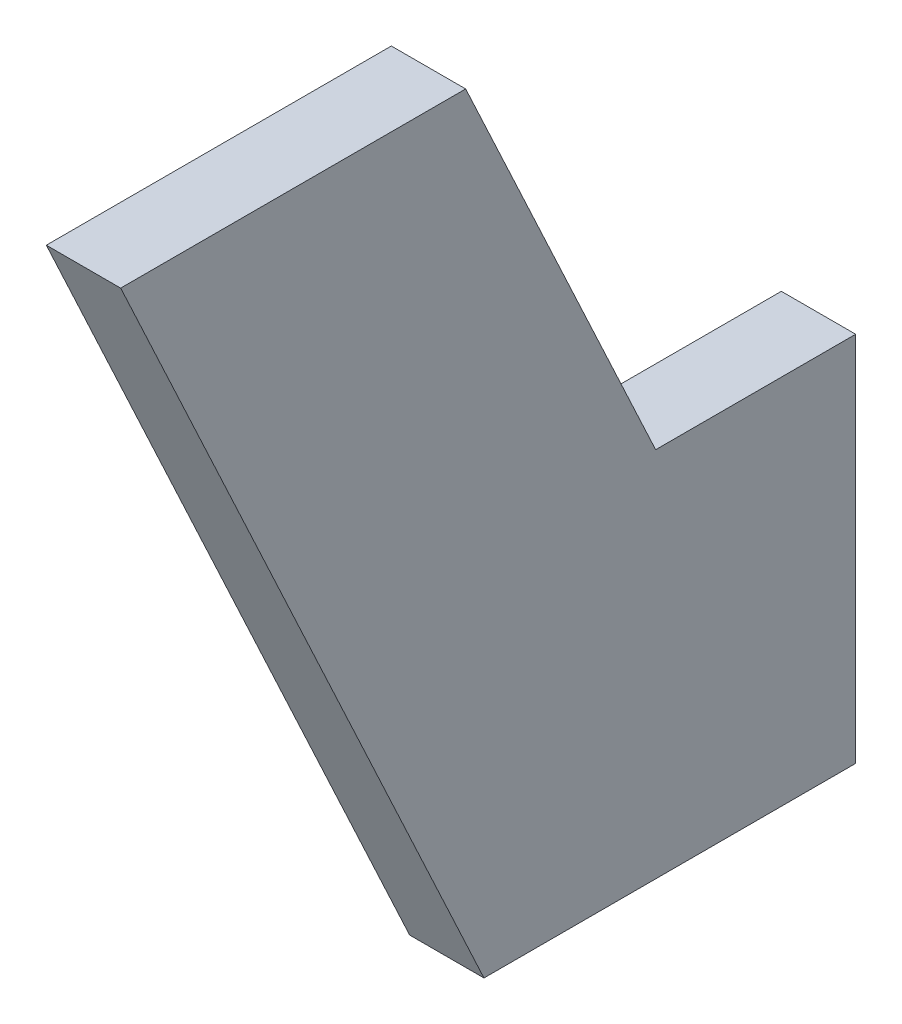
ISO-10303-21;
HEADER;
FILE_DESCRIPTION(('STEP AP214'),'2;1');
FILE_NAME('part.step','',(''),(''),'','','');
FILE_SCHEMA(('AUTOMOTIVE_DESIGN { 1 0 10303 214 1 1 1 1 }'));
ENDSEC;
DATA;
#1=APPLICATION_CONTEXT('core data for automotive mechanical design processes');
#2=APPLICATION_PROTOCOL_DEFINITION('international standard','automotive_design',2000,#1);
#3=PRODUCT_CONTEXT('',#1,'mechanical');
#4=PRODUCT('Part','Part','',(#3));
#5=PRODUCT_RELATED_PRODUCT_CATEGORY('part','',(#4));
#6=PRODUCT_DEFINITION_FORMATION('','',#4);
#7=PRODUCT_DEFINITION_CONTEXT('part definition',#1,'design');
#8=PRODUCT_DEFINITION('design','',#6,#7);
#9=PRODUCT_DEFINITION_SHAPE('','',#8);
#10=(LENGTH_UNIT() NAMED_UNIT(*) SI_UNIT(.MILLI.,.METRE.));
#11=(NAMED_UNIT(*) PLANE_ANGLE_UNIT() SI_UNIT($,.RADIAN.));
#12=(NAMED_UNIT(*) SI_UNIT($,.STERADIAN.) SOLID_ANGLE_UNIT());
#13=UNCERTAINTY_MEASURE_WITH_UNIT(LENGTH_MEASURE(1.E-05),#10,'distance_accuracy_value','');
#14=(GEOMETRIC_REPRESENTATION_CONTEXT(3) GLOBAL_UNCERTAINTY_ASSIGNED_CONTEXT((#13)) GLOBAL_UNIT_ASSIGNED_CONTEXT((#10,
#11,#12)) REPRESENTATION_CONTEXT('',''));
#15=CARTESIAN_POINT('',(0.,0.,0.));
#16=DIRECTION('',(0.,0.,1.));
#17=DIRECTION('',(1.,0.,0.));
#18=AXIS2_PLACEMENT_3D('',#15,#16,#17);
#19=CARTESIAN_POINT('',(0.,0.,0.));
#20=DIRECTION('',(0.,0.,1.));
#21=DIRECTION('',(1.,0.,0.));
#22=AXIS2_PLACEMENT_3D('',#19,#20,#21);
#23=PLANE('',#22);
#24=DIRECTION('',(0.,1.,0.));
#25=VECTOR('',#24,1.);
#26=CARTESIAN_POINT('',(7.99999999999999,40.,0.));
#27=LINE('',#26,#25);
#28=CARTESIAN_POINT('',(8.,-40.,0.));
#29=VERTEX_POINT('',#28);
#30=CARTESIAN_POINT('',(7.99999999999999,40.,0.));
#31=VERTEX_POINT('',#30);
#32=EDGE_CURVE('E136',#29,#31,#27,.T.);
#33=ORIENTED_EDGE('',*,*,#32,.F.);
#34=DIRECTION('',(1.,0.,0.));
#35=VECTOR('',#34,1.);
#36=CARTESIAN_POINT('',(-8.,-40.,0.));
#37=LINE('',#36,#35);
#38=CARTESIAN_POINT('',(-8.,-40.,0.));
#39=VERTEX_POINT('',#38);
#40=EDGE_CURVE('E141',#39,#29,#37,.T.);
#41=ORIENTED_EDGE('',*,*,#40,.F.);
#42=DIRECTION('',(0.,-1.,0.));
#43=VECTOR('',#42,1.);
#44=CARTESIAN_POINT('',(-8.00000000000001,40.,0.));
#45=LINE('',#44,#43);
#46=CARTESIAN_POINT('',(-8.00000000000001,40.,0.));
#47=VERTEX_POINT('',#46);
#48=EDGE_CURVE('E146',#47,#39,#45,.T.);
#49=ORIENTED_EDGE('',*,*,#48,.F.);
#50=DIRECTION('',(-1.,0.,0.));
#51=VECTOR('',#50,1.);
#52=CARTESIAN_POINT('',(-8.00000000000001,40.,0.));
#53=LINE('',#52,#51);
#54=EDGE_CURVE('E144',#31,#47,#53,.T.);
#55=ORIENTED_EDGE('',*,*,#54,.F.);
#56=EDGE_LOOP('',(#33,#41,#49,#55));
#57=FACE_BOUND('',#56,.T.);
#58=CARTESIAN_POINT('',(0.,32.0000000000001,0.));
#59=DIRECTION('',(0.,0.,1.));
#60=DIRECTION('',(1.,0.,0.));
#61=AXIS2_PLACEMENT_3D('',#58,#59,#60);
#62=CIRCLE('',#61,2.25);
#63=CARTESIAN_POINT('',(2.25,32.0000000000001,0.));
#64=VERTEX_POINT('',#63);
#65=EDGE_CURVE('E133',#64,#64,#62,.T.);
#66=ORIENTED_EDGE('',*,*,#65,.T.);
#67=EDGE_LOOP('',(#66));
#68=FACE_BOUND('',#67,.T.);
#69=CARTESIAN_POINT('',(0.,0.,0.));
#70=DIRECTION('',(0.,0.,1.));
#71=DIRECTION('',(1.,0.,0.));
#72=AXIS2_PLACEMENT_3D('',#69,#70,#71);
#73=CIRCLE('',#72,2.25);
#74=CARTESIAN_POINT('',(2.25,0.,0.));
#75=VERTEX_POINT('',#74);
#76=EDGE_CURVE('E130',#75,#75,#73,.T.);
#77=ORIENTED_EDGE('',*,*,#76,.T.);
#78=EDGE_LOOP('',(#77));
#79=FACE_BOUND('',#78,.T.);
#80=CARTESIAN_POINT('',(0.,-32.,0.));
#81=DIRECTION('',(0.,0.,1.));
#82=DIRECTION('',(1.,0.,0.));
#83=AXIS2_PLACEMENT_3D('',#80,#81,#82);
#84=CIRCLE('',#83,2.25);
#85=CARTESIAN_POINT('',(2.25000000000001,-32.,0.));
#86=VERTEX_POINT('',#85);
#87=EDGE_CURVE('E123',#86,#86,#84,.T.);
#88=ORIENTED_EDGE('',*,*,#87,.T.);
#89=EDGE_LOOP('',(#88));
#90=FACE_BOUND('',#89,.T.);
#91=ADVANCED_FACE('F39',(#57,#68,#79,#90),#23,.F.);
#92=CARTESIAN_POINT('',(7.99999999999999,40.,80.));
#93=DIRECTION('',(-1.,0.,0.));
#94=DIRECTION('',(0.,-1.,0.));
#95=AXIS2_PLACEMENT_3D('',#92,#93,#94);
#96=PLANE('',#95);
#97=DIRECTION('',(0.,0.,-1.));
#98=VECTOR('',#97,1.);
#99=CARTESIAN_POINT('',(7.99999999999999,40.,80.));
#100=LINE('',#99,#98);
#101=CARTESIAN_POINT('',(7.99999999999999,40.,43.050716262653));
#102=VERTEX_POINT('',#101);
#103=EDGE_CURVE('E154',#102,#31,#100,.T.);
#104=ORIENTED_EDGE('',*,*,#103,.F.);
#105=DIRECTION('',(0.,0.906307787036651,0.422618261740697));
#106=VECTOR('',#105,1.);
#107=CARTESIAN_POINT('',(7.99999999999998,127.697589273671,83.9447737426972));
#108=LINE('',#107,#106);
#109=CARTESIAN_POINT('',(7.99999999999998,127.697589273671,83.9447737426972));
#110=VERTEX_POINT('',#109);
#111=EDGE_CURVE('E120',#102,#110,#108,.T.);
#112=ORIENTED_EDGE('',*,*,#111,.T.);
#113=DIRECTION('',(0.,0.,1.));
#114=VECTOR('',#113,1.);
#115=CARTESIAN_POINT('',(7.99999999999998,127.697589273671,158.198670132444));
#116=LINE('',#115,#114);
#117=CARTESIAN_POINT('',(7.99999999999998,127.697589273671,158.198670132444));
#118=VERTEX_POINT('',#117);
#119=EDGE_CURVE('E98',#110,#118,#116,.T.);
#120=ORIENTED_EDGE('',*,*,#119,.T.);
#121=DIRECTION('',(0.,-0.906307787036651,-0.422618261740697));
#122=VECTOR('',#121,1.);
#123=CARTESIAN_POINT('',(8.,-40.,80.));
#124=LINE('',#123,#122);
#125=CARTESIAN_POINT('',(8.,-40.,80.));
#126=VERTEX_POINT('',#125);
#127=EDGE_CURVE('E114',#118,#126,#124,.T.);
#128=ORIENTED_EDGE('',*,*,#127,.T.);
#129=DIRECTION('',(0.,0.,-1.));
#130=VECTOR('',#129,1.);
#131=CARTESIAN_POINT('',(8.,-40.,80.));
#132=LINE('',#131,#130);
#133=EDGE_CURVE('E140',#126,#29,#132,.T.);
#134=ORIENTED_EDGE('',*,*,#133,.T.);
#135=ORIENTED_EDGE('',*,*,#32,.T.);
#136=EDGE_LOOP('',(#104,#112,#120,#128,#134,#135));
#137=FACE_BOUND('',#136,.T.);
#138=ADVANCED_FACE('F41',(#137),#96,.F.);
#139=CARTESIAN_POINT('',(-8.00000000000001,40.,80.));
#140=DIRECTION('',(0.,-1.,0.));
#141=DIRECTION('',(0.,0.,-1.));
#142=AXIS2_PLACEMENT_3D('',#139,#140,#141);
#143=PLANE('',#142);
#144=DIRECTION('',(0.,0.,-1.));
#145=VECTOR('',#144,1.);
#146=CARTESIAN_POINT('',(-8.00000000000001,40.,80.));
#147=LINE('',#146,#145);
#148=CARTESIAN_POINT('',(-8.00000000000001,40.,43.050716262653));
#149=VERTEX_POINT('',#148);
#150=EDGE_CURVE('E61',#149,#47,#147,.T.);
#151=ORIENTED_EDGE('',*,*,#150,.F.);
#152=DIRECTION('',(1.,0.,0.));
#153=VECTOR('',#152,1.);
#154=CARTESIAN_POINT('',(-8.00000000000001,40.,43.050716262653));
#155=LINE('',#154,#153);
#156=EDGE_CURVE('E56',#149,#102,#155,.T.);
#157=ORIENTED_EDGE('',*,*,#156,.T.);
#158=ORIENTED_EDGE('',*,*,#103,.T.);
#159=ORIENTED_EDGE('',*,*,#54,.T.);
#160=EDGE_LOOP('',(#151,#157,#158,#159));
#161=FACE_BOUND('',#160,.T.);
#162=ADVANCED_FACE('F174',(#161),#143,.F.);
#163=CARTESIAN_POINT('',(-8.00000000000001,40.,80.));
#164=DIRECTION('',(1.,0.,0.));
#165=DIRECTION('',(0.,1.,0.));
#166=AXIS2_PLACEMENT_3D('',#163,#164,#165);
#167=PLANE('',#166);
#168=DIRECTION('',(0.,0.,-1.));
#169=VECTOR('',#168,1.);
#170=CARTESIAN_POINT('',(-8.,-40.,80.));
#171=LINE('',#170,#169);
#172=CARTESIAN_POINT('',(-8.,-40.,80.));
#173=VERTEX_POINT('',#172);
#174=EDGE_CURVE('E151',#173,#39,#171,.T.);
#175=ORIENTED_EDGE('',*,*,#174,.F.);
#176=DIRECTION('',(0.,-0.906307787036651,-0.422618261740697));
#177=VECTOR('',#176,1.);
#178=CARTESIAN_POINT('',(-8.,3.68928857006015,100.372649839563));
#179=LINE('',#178,#177);
#180=CARTESIAN_POINT('',(-8.00000000000002,127.697589273671,158.198670132444));
#181=VERTEX_POINT('',#180);
#182=EDGE_CURVE('E111',#181,#173,#179,.T.);
#183=ORIENTED_EDGE('',*,*,#182,.F.);
#184=DIRECTION('',(0.,0.,1.));
#185=VECTOR('',#184,1.);
#186=CARTESIAN_POINT('',(-8.00000000000002,127.697589273671,158.198670132444));
#187=LINE('',#186,#185);
#188=CARTESIAN_POINT('',(-8.00000000000002,127.697589273671,83.9447737426972));
#189=VERTEX_POINT('',#188);
#190=EDGE_CURVE('E96',#189,#181,#187,.T.);
#191=ORIENTED_EDGE('',*,*,#190,.F.);
#192=DIRECTION('',(0.,0.906307787036651,0.422618261740697));
#193=VECTOR('',#192,1.);
#194=CARTESIAN_POINT('',(-8.00000000000002,127.697589273671,83.9447737426972));
#195=LINE('',#194,#193);
#196=EDGE_CURVE('E109',#149,#189,#195,.T.);
#197=ORIENTED_EDGE('',*,*,#196,.F.);
#198=ORIENTED_EDGE('',*,*,#150,.T.);
#199=ORIENTED_EDGE('',*,*,#48,.T.);
#200=EDGE_LOOP('',(#175,#183,#191,#197,#198,#199));
#201=FACE_BOUND('',#200,.T.);
#202=ADVANCED_FACE('F108',(#201),#167,.F.);
#203=CARTESIAN_POINT('',(-8.,-40.,80.));
#204=DIRECTION('',(0.,1.,0.));
#205=DIRECTION('',(0.,0.,1.));
#206=AXIS2_PLACEMENT_3D('',#203,#204,#205);
#207=PLANE('',#206);
#208=ORIENTED_EDGE('',*,*,#40,.T.);
#209=ORIENTED_EDGE('',*,*,#133,.F.);
#210=DIRECTION('',(1.,0.,0.));
#211=VECTOR('',#210,1.);
#212=CARTESIAN_POINT('',(-8.,-40.,80.));
#213=LINE('',#212,#211);
#214=EDGE_CURVE('E137',#173,#126,#213,.T.);
#215=ORIENTED_EDGE('',*,*,#214,.F.);
#216=ORIENTED_EDGE('',*,*,#174,.T.);
#217=EDGE_LOOP('',(#208,#209,#215,#216));
#218=FACE_BOUND('',#217,.T.);
#219=ADVANCED_FACE('F182',(#218),#207,.F.);
#220=CARTESIAN_POINT('',(0.,32.0000000000001,80.));
#221=DIRECTION('',(0.,0.,-1.));
#222=DIRECTION('',(-1.,0.,0.));
#223=AXIS2_PLACEMENT_3D('',#220,#221,#222);
#224=CYLINDRICAL_SURFACE('',#223,2.25);
#225=CARTESIAN_POINT('',(0.,32.0000000000001,46.7456446363877));
#226=DIRECTION('',(0.,-0.419303333334967,-0.907846195483676));
#227=DIRECTION('',(0.,0.907846195483676,-0.419303333334967));
#228=AXIS2_PLACEMENT_3D('',#225,#226,#227);
#229=ELLIPSE('',#228,2.47839337895915,2.25);
#230=CARTESIAN_POINT('',(0.,34.2500000000001,45.7064460312748));
#231=VERTEX_POINT('',#230);
#232=EDGE_CURVE('E11',#231,#231,#229,.T.);
#233=ORIENTED_EDGE('',*,*,#232,.F.);
#234=EDGE_LOOP('',(#233));
#235=FACE_BOUND('',#234,.T.);
#236=ORIENTED_EDGE('',*,*,#65,.F.);
#237=EDGE_LOOP('',(#236));
#238=FACE_BOUND('',#237,.T.);
#239=ADVANCED_FACE('F180',(#235,#238),#224,.F.);
#240=CARTESIAN_POINT('',(0.,0.,80.));
#241=DIRECTION('',(0.,0.,-1.));
#242=DIRECTION('',(-1.,0.,0.));
#243=AXIS2_PLACEMENT_3D('',#240,#241,#242);
#244=CYLINDRICAL_SURFACE('',#243,2.25);
#245=CARTESIAN_POINT('',(0.,0.,61.5253581313265));
#246=DIRECTION('',(0.,-0.419303333334967,-0.907846195483676));
#247=DIRECTION('',(0.,0.907846195483676,-0.419303333334967));
#248=AXIS2_PLACEMENT_3D('',#245,#246,#247);
#249=ELLIPSE('',#248,2.47839337895915,2.25);
#250=CARTESIAN_POINT('',(0.,2.25,60.4861595262136));
#251=VERTEX_POINT('',#250);
#252=EDGE_CURVE('E48',#251,#251,#249,.T.);
#253=ORIENTED_EDGE('',*,*,#252,.F.);
#254=EDGE_LOOP('',(#253));
#255=FACE_BOUND('',#254,.T.);
#256=ORIENTED_EDGE('',*,*,#76,.F.);
#257=EDGE_LOOP('',(#256));
#258=FACE_BOUND('',#257,.T.);
#259=ADVANCED_FACE('F164',(#255,#258),#244,.F.);
#260=CARTESIAN_POINT('',(0.,-32.,80.));
#261=DIRECTION('',(0.,0.,-1.));
#262=DIRECTION('',(-1.,0.,0.));
#263=AXIS2_PLACEMENT_3D('',#260,#261,#262);
#264=CYLINDRICAL_SURFACE('',#263,2.25);
#265=CARTESIAN_POINT('',(0.,-32.,76.3050716262653));
#266=DIRECTION('',(0.,-0.419303333334967,-0.907846195483676));
#267=DIRECTION('',(0.,0.907846195483676,-0.419303333334967));
#268=AXIS2_PLACEMENT_3D('',#265,#266,#267);
#269=ELLIPSE('',#268,2.47839337895915,2.25);
#270=CARTESIAN_POINT('',(0.,-29.75,75.2658730211524));
#271=VERTEX_POINT('',#270);
#272=EDGE_CURVE('E43',#271,#271,#269,.T.);
#273=ORIENTED_EDGE('',*,*,#272,.F.);
#274=EDGE_LOOP('',(#273));
#275=FACE_BOUND('',#274,.T.);
#276=ORIENTED_EDGE('',*,*,#87,.F.);
#277=EDGE_LOOP('',(#276));
#278=FACE_BOUND('',#277,.T.);
#279=ADVANCED_FACE('F161',(#275,#278),#264,.F.);
#280=CARTESIAN_POINT('',(-8.00000000000001,40.,43.050716262653));
#281=DIRECTION('',(0.,-0.419303333334967,-0.907846195483676));
#282=DIRECTION('',(0.,0.907846195483676,-0.419303333334967));
#283=AXIS2_PLACEMENT_3D('',#280,#281,#282);
#284=PLANE('',#283);
#285=ORIENTED_EDGE('',*,*,#272,.T.);
#286=EDGE_LOOP('',(#285));
#287=FACE_BOUND('',#286,.T.);
#288=ADVANCED_FACE('F159',(#287),#284,.T.);
#289=ORIENTED_EDGE('',*,*,#252,.T.);
#290=EDGE_LOOP('',(#289));
#291=FACE_BOUND('',#290,.T.);
#292=ADVANCED_FACE('F229',(#291),#284,.T.);
#293=ORIENTED_EDGE('',*,*,#232,.T.);
#294=EDGE_LOOP('',(#293));
#295=FACE_BOUND('',#294,.T.);
#296=ADVANCED_FACE('F231',(#295),#284,.T.);
#297=CARTESIAN_POINT('',(-8.,-40.,80.));
#298=DIRECTION('',(0.,-0.422618261740697,0.906307787036651));
#299=DIRECTION('',(0.,-0.906307787036651,-0.422618261740697));
#300=AXIS2_PLACEMENT_3D('',#297,#298,#299);
#301=PLANE('',#300);
#302=ORIENTED_EDGE('',*,*,#127,.F.);
#303=DIRECTION('',(1.,0.,0.));
#304=VECTOR('',#303,1.);
#305=CARTESIAN_POINT('',(-8.00000000000002,127.697589273671,158.198670132444));
#306=LINE('',#305,#304);
#307=EDGE_CURVE('E103',#181,#118,#306,.T.);
#308=ORIENTED_EDGE('',*,*,#307,.F.);
#309=ORIENTED_EDGE('',*,*,#182,.T.);
#310=ORIENTED_EDGE('',*,*,#214,.T.);
#311=EDGE_LOOP('',(#302,#308,#309,#310));
#312=FACE_BOUND('',#311,.T.);
#313=ADVANCED_FACE('F245',(#312),#301,.T.);
#314=CARTESIAN_POINT('',(-8.00000000000002,127.697589273671,158.198670132444));
#315=DIRECTION('',(0.,1.,0.));
#316=DIRECTION('',(-1.,0.,0.));
#317=AXIS2_PLACEMENT_3D('',#314,#315,#316);
#318=PLANE('',#317);
#319=ORIENTED_EDGE('',*,*,#119,.F.);
#320=DIRECTION('',(1.,0.,0.));
#321=VECTOR('',#320,1.);
#322=CARTESIAN_POINT('',(-8.00000000000002,127.697589273671,83.9447737426972));
#323=LINE('',#322,#321);
#324=EDGE_CURVE('E92',#189,#110,#323,.T.);
#325=ORIENTED_EDGE('',*,*,#324,.F.);
#326=ORIENTED_EDGE('',*,*,#190,.T.);
#327=ORIENTED_EDGE('',*,*,#307,.T.);
#328=EDGE_LOOP('',(#319,#325,#326,#327));
#329=FACE_BOUND('',#328,.T.);
#330=ADVANCED_FACE('F94',(#329),#318,.T.);
#331=CARTESIAN_POINT('',(-8.00000000000002,127.697589273671,83.9447737426972));
#332=DIRECTION('',(0.,0.422618261740697,-0.906307787036651));
#333=DIRECTION('',(0.,0.906307787036651,0.422618261740697));
#334=AXIS2_PLACEMENT_3D('',#331,#332,#333);
#335=PLANE('',#334);
#336=ORIENTED_EDGE('',*,*,#111,.F.);
#337=ORIENTED_EDGE('',*,*,#156,.F.);
#338=ORIENTED_EDGE('',*,*,#196,.T.);
#339=ORIENTED_EDGE('',*,*,#324,.T.);
#340=EDGE_LOOP('',(#336,#337,#338,#339));
#341=FACE_BOUND('',#340,.T.);
#342=ADVANCED_FACE('F113',(#341),#335,.T.);
#343=CLOSED_SHELL('',(#91,#138,#162,#202,#219,#239,#259,#279,#288,#292,#296,#313,#330,#342));
#344=MANIFOLD_SOLID_BREP('B2',#343);
#345=ADVANCED_BREP_SHAPE_REPRESENTATION('',(#18,#344),#14);
#346=SHAPE_DEFINITION_REPRESENTATION(#9,#345);
ENDSEC;
END-ISO-10303-21;
